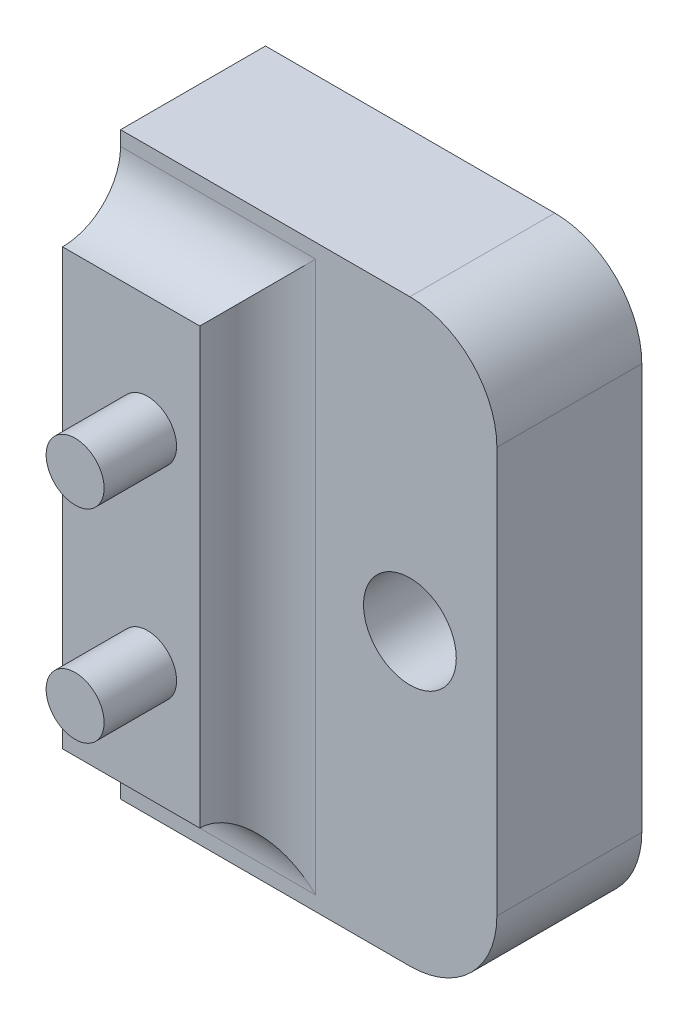
ISO-10303-21;
HEADER;
FILE_DESCRIPTION(('STEP AP214'),'2;1');
FILE_NAME('part.step','',(''),(''),'','','');
FILE_SCHEMA(('AUTOMOTIVE_DESIGN { 1 0 10303 214 1 1 1 1 }'));
ENDSEC;
DATA;
#1=APPLICATION_CONTEXT('core data for automotive mechanical design processes');
#2=APPLICATION_PROTOCOL_DEFINITION('international standard','automotive_design',2000,#1);
#3=PRODUCT_CONTEXT('',#1,'mechanical');
#4=PRODUCT('Part','Part','',(#3));
#5=PRODUCT_RELATED_PRODUCT_CATEGORY('part','',(#4));
#6=PRODUCT_DEFINITION_FORMATION('','',#4);
#7=PRODUCT_DEFINITION_CONTEXT('part definition',#1,'design');
#8=PRODUCT_DEFINITION('design','',#6,#7);
#9=PRODUCT_DEFINITION_SHAPE('','',#8);
#10=(LENGTH_UNIT() NAMED_UNIT(*) SI_UNIT(.MILLI.,.METRE.));
#11=(NAMED_UNIT(*) PLANE_ANGLE_UNIT() SI_UNIT($,.RADIAN.));
#12=(NAMED_UNIT(*) SI_UNIT($,.STERADIAN.) SOLID_ANGLE_UNIT());
#13=UNCERTAINTY_MEASURE_WITH_UNIT(LENGTH_MEASURE(1.E-05),#10,'distance_accuracy_value','');
#14=(GEOMETRIC_REPRESENTATION_CONTEXT(3) GLOBAL_UNCERTAINTY_ASSIGNED_CONTEXT((#13)) GLOBAL_UNIT_ASSIGNED_CONTEXT((#10,
#11,#12)) REPRESENTATION_CONTEXT('',''));
#15=CARTESIAN_POINT('',(0.,0.,0.));
#16=DIRECTION('',(0.,0.,1.));
#17=DIRECTION('',(1.,0.,0.));
#18=AXIS2_PLACEMENT_3D('',#15,#16,#17);
#19=CARTESIAN_POINT('',(12.,17.,5.));
#20=DIRECTION('',(0.,0.,-1.));
#21=DIRECTION('',(-1.,0.,0.));
#22=AXIS2_PLACEMENT_3D('',#19,#20,#21);
#23=PLANE('',#22);
#24=CARTESIAN_POINT('',(12.,10.,5.));
#25=DIRECTION('',(0.,0.,1.));
#26=DIRECTION('',(1.,0.,0.));
#27=AXIS2_PLACEMENT_3D('',#24,#25,#26);
#28=CIRCLE('',#27,1.6);
#29=CARTESIAN_POINT('',(13.6,10.,5.));
#30=VERTEX_POINT('',#29);
#31=EDGE_CURVE('E153',#30,#30,#28,.T.);
#32=ORIENTED_EDGE('',*,*,#31,.F.);
#33=EDGE_LOOP('',(#32));
#34=FACE_BOUND('',#33,.T.);
#35=DIRECTION('',(0.,1.,0.));
#36=VECTOR('',#35,1.);
#37=CARTESIAN_POINT('',(2.0176007858653,17.,5.));
#38=LINE('',#37,#36);
#39=CARTESIAN_POINT('',(2.0176007858653,0.,5.));
#40=VERTEX_POINT('',#39);
#41=CARTESIAN_POINT('',(2.0176007858653,0.500000000000002,5.));
#42=VERTEX_POINT('',#41);
#43=EDGE_CURVE('E123',#40,#42,#38,.T.);
#44=ORIENTED_EDGE('',*,*,#43,.F.);
#45=DIRECTION('',(1.,0.,0.));
#46=VECTOR('',#45,1.);
#47=CARTESIAN_POINT('',(0.,0.,5.));
#48=LINE('',#47,#46);
#49=CARTESIAN_POINT('',(12.,0.,5.));
#50=VERTEX_POINT('',#49);
#51=EDGE_CURVE('E159',#40,#50,#48,.T.);
#52=ORIENTED_EDGE('',*,*,#51,.T.);
#53=CARTESIAN_POINT('',(12.,3.,5.));
#54=DIRECTION('',(0.,0.,1.));
#55=DIRECTION('',(1.,0.,0.));
#56=AXIS2_PLACEMENT_3D('',#53,#54,#55);
#57=CIRCLE('',#56,3.);
#58=CARTESIAN_POINT('',(15.,3.,5.));
#59=VERTEX_POINT('',#58);
#60=EDGE_CURVE('E161',#50,#59,#57,.T.);
#61=ORIENTED_EDGE('',*,*,#60,.T.);
#62=DIRECTION('',(0.,1.,0.));
#63=VECTOR('',#62,1.);
#64=CARTESIAN_POINT('',(15.,3.00000000000002,5.));
#65=LINE('',#64,#63);
#66=CARTESIAN_POINT('',(15.,17.,5.));
#67=VERTEX_POINT('',#66);
#68=EDGE_CURVE('E164',#59,#67,#65,.T.);
#69=ORIENTED_EDGE('',*,*,#68,.T.);
#70=CARTESIAN_POINT('',(12.,17.,5.));
#71=DIRECTION('',(0.,0.,1.));
#72=DIRECTION('',(-1.,0.,0.));
#73=AXIS2_PLACEMENT_3D('',#70,#71,#72);
#74=CIRCLE('',#73,3.);
#75=CARTESIAN_POINT('',(12.,20.,5.));
#76=VERTEX_POINT('',#75);
#77=EDGE_CURVE('E166',#67,#76,#74,.T.);
#78=ORIENTED_EDGE('',*,*,#77,.T.);
#79=DIRECTION('',(-1.,0.,0.));
#80=VECTOR('',#79,1.);
#81=CARTESIAN_POINT('',(0.,20.,5.));
#82=LINE('',#81,#80);
#83=CARTESIAN_POINT('',(2.0176007858653,20.,5.));
#84=VERTEX_POINT('',#83);
#85=EDGE_CURVE('E120',#76,#84,#82,.T.);
#86=ORIENTED_EDGE('',*,*,#85,.T.);
#87=CARTESIAN_POINT('',(2.0176007858653,19.5,5.));
#88=VERTEX_POINT('',#87);
#89=EDGE_CURVE('E112',#88,#84,#38,.T.);
#90=ORIENTED_EDGE('',*,*,#89,.F.);
#91=DIRECTION('',(-1.,0.,0.));
#92=VECTOR('',#91,1.);
#93=CARTESIAN_POINT('',(6.75,19.5,5.));
#94=LINE('',#93,#92);
#95=CARTESIAN_POINT('',(8.75,19.5,5.));
#96=VERTEX_POINT('',#95);
#97=EDGE_CURVE('E46',#88,#96,#94,.F.);
#98=ORIENTED_EDGE('',*,*,#97,.T.);
#99=DIRECTION('',(0.,1.,0.));
#100=VECTOR('',#99,1.);
#101=CARTESIAN_POINT('',(8.75,2.5,5.));
#102=LINE('',#101,#100);
#103=CARTESIAN_POINT('',(8.75,0.500000000000002,5.));
#104=VERTEX_POINT('',#103);
#105=EDGE_CURVE('E128',#96,#104,#102,.F.);
#106=ORIENTED_EDGE('',*,*,#105,.T.);
#107=DIRECTION('',(1.,0.,0.));
#108=VECTOR('',#107,1.);
#109=CARTESIAN_POINT('',(0.,0.500000000000002,5.));
#110=LINE('',#109,#108);
#111=EDGE_CURVE('E130',#104,#42,#110,.F.);
#112=ORIENTED_EDGE('',*,*,#111,.T.);
#113=EDGE_LOOP('',(#44,#52,#61,#69,#78,#86,#90,#98,#106,#112));
#114=FACE_BOUND('',#113,.T.);
#115=ADVANCED_FACE('F38',(#34,#114),#23,.F.);
#116=CARTESIAN_POINT('',(12.,17.,0.));
#117=DIRECTION('',(0.,0.,-1.));
#118=DIRECTION('',(-1.,0.,0.));
#119=AXIS2_PLACEMENT_3D('',#116,#117,#118);
#120=PLANE('',#119);
#121=CARTESIAN_POINT('',(12.,10.,0.));
#122=DIRECTION('',(0.,0.,1.));
#123=DIRECTION('',(1.,0.,0.));
#124=AXIS2_PLACEMENT_3D('',#121,#122,#123);
#125=CIRCLE('',#124,1.6);
#126=CARTESIAN_POINT('',(13.6,10.,0.));
#127=VERTEX_POINT('',#126);
#128=EDGE_CURVE('E152',#127,#127,#125,.T.);
#129=ORIENTED_EDGE('',*,*,#128,.T.);
#130=EDGE_LOOP('',(#129));
#131=FACE_BOUND('',#130,.T.);
#132=DIRECTION('',(1.,0.,0.));
#133=VECTOR('',#132,1.);
#134=CARTESIAN_POINT('',(0.,0.,0.));
#135=LINE('',#134,#133);
#136=CARTESIAN_POINT('',(2.0176007858653,0.,0.));
#137=VERTEX_POINT('',#136);
#138=CARTESIAN_POINT('',(12.,0.,0.));
#139=VERTEX_POINT('',#138);
#140=EDGE_CURVE('E156',#137,#139,#135,.T.);
#141=ORIENTED_EDGE('',*,*,#140,.F.);
#142=DIRECTION('',(0.,1.,0.));
#143=VECTOR('',#142,1.);
#144=CARTESIAN_POINT('',(2.0176007858653,17.,0.));
#145=LINE('',#144,#143);
#146=CARTESIAN_POINT('',(2.0176007858653,20.,0.));
#147=VERTEX_POINT('',#146);
#148=EDGE_CURVE('E196',#137,#147,#145,.T.);
#149=ORIENTED_EDGE('',*,*,#148,.T.);
#150=DIRECTION('',(-1.,0.,0.));
#151=VECTOR('',#150,1.);
#152=CARTESIAN_POINT('',(0.,20.,0.));
#153=LINE('',#152,#151);
#154=CARTESIAN_POINT('',(12.,20.,0.));
#155=VERTEX_POINT('',#154);
#156=EDGE_CURVE('E162',#155,#147,#153,.T.);
#157=ORIENTED_EDGE('',*,*,#156,.F.);
#158=CARTESIAN_POINT('',(12.,17.,0.));
#159=DIRECTION('',(0.,0.,1.));
#160=DIRECTION('',(-1.,0.,0.));
#161=AXIS2_PLACEMENT_3D('',#158,#159,#160);
#162=CIRCLE('',#161,3.);
#163=CARTESIAN_POINT('',(15.,17.,0.));
#164=VERTEX_POINT('',#163);
#165=EDGE_CURVE('E175',#164,#155,#162,.T.);
#166=ORIENTED_EDGE('',*,*,#165,.F.);
#167=DIRECTION('',(0.,1.,0.));
#168=VECTOR('',#167,1.);
#169=CARTESIAN_POINT('',(15.,3.00000000000002,0.));
#170=LINE('',#169,#168);
#171=CARTESIAN_POINT('',(15.,3.,0.));
#172=VERTEX_POINT('',#171);
#173=EDGE_CURVE('E173',#172,#164,#170,.T.);
#174=ORIENTED_EDGE('',*,*,#173,.F.);
#175=CARTESIAN_POINT('',(12.,3.,0.));
#176=DIRECTION('',(0.,0.,1.));
#177=DIRECTION('',(1.,0.,0.));
#178=AXIS2_PLACEMENT_3D('',#175,#176,#177);
#179=CIRCLE('',#178,3.);
#180=EDGE_CURVE('E171',#139,#172,#179,.T.);
#181=ORIENTED_EDGE('',*,*,#180,.F.);
#182=EDGE_LOOP('',(#141,#149,#157,#166,#174,#181));
#183=FACE_BOUND('',#182,.T.);
#184=ADVANCED_FACE('F237',(#131,#183),#120,.T.);
#185=CARTESIAN_POINT('',(0.,0.,5.));
#186=DIRECTION('',(0.,1.,0.));
#187=DIRECTION('',(0.,0.,1.));
#188=AXIS2_PLACEMENT_3D('',#185,#186,#187);
#189=PLANE('',#188);
#190=DIRECTION('',(0.,0.,1.));
#191=VECTOR('',#190,1.);
#192=CARTESIAN_POINT('',(2.0176007858653,0.,5.));
#193=LINE('',#192,#191);
#194=EDGE_CURVE('E202',#137,#40,#193,.T.);
#195=ORIENTED_EDGE('',*,*,#194,.F.);
#196=ORIENTED_EDGE('',*,*,#140,.T.);
#197=DIRECTION('',(0.,0.,-1.));
#198=VECTOR('',#197,1.);
#199=CARTESIAN_POINT('',(12.,0.,5.));
#200=LINE('',#199,#198);
#201=EDGE_CURVE('E187',#50,#139,#200,.T.);
#202=ORIENTED_EDGE('',*,*,#201,.F.);
#203=ORIENTED_EDGE('',*,*,#51,.F.);
#204=EDGE_LOOP('',(#195,#196,#202,#203));
#205=FACE_BOUND('',#204,.T.);
#206=ADVANCED_FACE('F243',(#205),#189,.F.);
#207=CARTESIAN_POINT('',(0.,20.,5.));
#208=DIRECTION('',(0.,-1.,0.));
#209=DIRECTION('',(0.,0.,-1.));
#210=AXIS2_PLACEMENT_3D('',#207,#208,#209);
#211=PLANE('',#210);
#212=DIRECTION('',(0.,0.,-1.));
#213=VECTOR('',#212,1.);
#214=CARTESIAN_POINT('',(2.0176007858653,20.,5.));
#215=LINE('',#214,#213);
#216=EDGE_CURVE('E194',#84,#147,#215,.T.);
#217=ORIENTED_EDGE('',*,*,#216,.F.);
#218=ORIENTED_EDGE('',*,*,#85,.F.);
#219=DIRECTION('',(0.,0.,-1.));
#220=VECTOR('',#219,1.);
#221=CARTESIAN_POINT('',(12.,20.,5.));
#222=LINE('',#221,#220);
#223=EDGE_CURVE('E169',#76,#155,#222,.T.);
#224=ORIENTED_EDGE('',*,*,#223,.T.);
#225=ORIENTED_EDGE('',*,*,#156,.T.);
#226=EDGE_LOOP('',(#217,#218,#224,#225));
#227=FACE_BOUND('',#226,.T.);
#228=ADVANCED_FACE('F219',(#227),#211,.F.);
#229=CARTESIAN_POINT('',(0.,0.,7.));
#230=DIRECTION('',(0.,0.,1.));
#231=DIRECTION('',(1.,0.,0.));
#232=AXIS2_PLACEMENT_3D('',#229,#230,#231);
#233=PLANE('',#232);
#234=CARTESIAN_POINT('',(4.95023571002158,6.5,7.));
#235=DIRECTION('',(0.,0.,1.));
#236=DIRECTION('',(1.,0.,0.));
#237=AXIS2_PLACEMENT_3D('',#234,#235,#236);
#238=CIRCLE('',#237,1.);
#239=CARTESIAN_POINT('',(5.95023571002158,6.5,7.));
#240=VERTEX_POINT('',#239);
#241=EDGE_CURVE('E204',#240,#240,#238,.T.);
#242=ORIENTED_EDGE('',*,*,#241,.F.);
#243=EDGE_LOOP('',(#242));
#244=FACE_BOUND('',#243,.T.);
#245=CARTESIAN_POINT('',(4.95023571002158,13.5,7.));
#246=DIRECTION('',(0.,0.,1.));
#247=DIRECTION('',(1.,0.,0.));
#248=AXIS2_PLACEMENT_3D('',#245,#246,#247);
#249=CIRCLE('',#248,1.);
#250=CARTESIAN_POINT('',(5.95023571002158,13.5,7.));
#251=VERTEX_POINT('',#250);
#252=EDGE_CURVE('E148',#251,#251,#249,.T.);
#253=ORIENTED_EDGE('',*,*,#252,.F.);
#254=EDGE_LOOP('',(#253));
#255=FACE_BOUND('',#254,.T.);
#256=DIRECTION('',(-1.,0.,0.));
#257=VECTOR('',#256,1.);
#258=CARTESIAN_POINT('',(0.,17.5,7.));
#259=LINE('',#258,#257);
#260=CARTESIAN_POINT('',(6.75,17.5,7.));
#261=VERTEX_POINT('',#260);
#262=CARTESIAN_POINT('',(2.0176007858653,17.5,7.));
#263=VERTEX_POINT('',#262);
#264=EDGE_CURVE('E145',#261,#263,#259,.T.);
#265=ORIENTED_EDGE('',*,*,#264,.T.);
#266=DIRECTION('',(0.,-1.,0.));
#267=VECTOR('',#266,1.);
#268=CARTESIAN_POINT('',(2.0176007858653,0.,7.));
#269=LINE('',#268,#267);
#270=CARTESIAN_POINT('',(2.0176007858653,2.5,7.));
#271=VERTEX_POINT('',#270);
#272=EDGE_CURVE('E52',#263,#271,#269,.T.);
#273=ORIENTED_EDGE('',*,*,#272,.T.);
#274=DIRECTION('',(1.,0.,0.));
#275=VECTOR('',#274,1.);
#276=CARTESIAN_POINT('',(0.,2.5,7.));
#277=LINE('',#276,#275);
#278=CARTESIAN_POINT('',(6.75,2.5,7.));
#279=VERTEX_POINT('',#278);
#280=EDGE_CURVE('E137',#271,#279,#277,.T.);
#281=ORIENTED_EDGE('',*,*,#280,.T.);
#282=DIRECTION('',(0.,1.,0.));
#283=VECTOR('',#282,1.);
#284=CARTESIAN_POINT('',(6.75,17.5,7.));
#285=LINE('',#284,#283);
#286=EDGE_CURVE('E141',#279,#261,#285,.T.);
#287=ORIENTED_EDGE('',*,*,#286,.T.);
#288=EDGE_LOOP('',(#265,#273,#281,#287));
#289=FACE_BOUND('',#288,.T.);
#290=ADVANCED_FACE('F217',(#244,#255,#289),#233,.T.);
#291=CARTESIAN_POINT('',(0.,0.500000000000002,7.));
#292=DIRECTION('',(-1.,0.,0.));
#293=DIRECTION('',(0.,0.,1.));
#294=AXIS2_PLACEMENT_3D('',#291,#292,#293);
#295=CYLINDRICAL_SURFACE('',#294,2.);
#296=CARTESIAN_POINT('',(2.0176007858653,0.500000000000002,7.));
#297=DIRECTION('',(-1.,0.,0.));
#298=DIRECTION('',(0.,0.,1.));
#299=AXIS2_PLACEMENT_3D('',#296,#297,#298);
#300=CIRCLE('',#299,2.);
#301=EDGE_CURVE('E121',#42,#271,#300,.F.);
#302=ORIENTED_EDGE('',*,*,#301,.F.);
#303=ORIENTED_EDGE('',*,*,#111,.F.);
#304=CARTESIAN_POINT('',(8.75,0.500000000000001,7.));
#305=DIRECTION('',(-0.707106781186547,-0.707106781186548,0.));
#306=DIRECTION('',(-0.707106781186548,0.707106781186547,0.));
#307=AXIS2_PLACEMENT_3D('',#304,#305,#306);
#308=ELLIPSE('',#307,2.82842712474619,2.);
#309=EDGE_CURVE('E134',#279,#104,#308,.T.);
#310=ORIENTED_EDGE('',*,*,#309,.F.);
#311=ORIENTED_EDGE('',*,*,#280,.F.);
#312=EDGE_LOOP('',(#302,#303,#310,#311));
#313=FACE_BOUND('',#312,.T.);
#314=ADVANCED_FACE('F40',(#313),#295,.F.);
#315=CARTESIAN_POINT('',(0.,19.5,7.));
#316=DIRECTION('',(1.,0.,0.));
#317=DIRECTION('',(0.,0.,-1.));
#318=AXIS2_PLACEMENT_3D('',#315,#316,#317);
#319=CYLINDRICAL_SURFACE('',#318,2.);
#320=CARTESIAN_POINT('',(2.0176007858653,19.5,7.));
#321=DIRECTION('',(-1.,0.,0.));
#322=DIRECTION('',(0.,0.,1.));
#323=AXIS2_PLACEMENT_3D('',#320,#321,#322);
#324=CIRCLE('',#323,2.);
#325=EDGE_CURVE('E11',#263,#88,#324,.F.);
#326=ORIENTED_EDGE('',*,*,#325,.F.);
#327=ORIENTED_EDGE('',*,*,#264,.F.);
#328=CARTESIAN_POINT('',(8.75,19.5,7.));
#329=DIRECTION('',(0.707106781186548,-0.707106781186547,0.));
#330=DIRECTION('',(-0.707106781186547,-0.707106781186548,0.));
#331=AXIS2_PLACEMENT_3D('',#328,#329,#330);
#332=ELLIPSE('',#331,2.82842712474619,2.);
#333=EDGE_CURVE('E127',#261,#96,#332,.T.);
#334=ORIENTED_EDGE('',*,*,#333,.T.);
#335=ORIENTED_EDGE('',*,*,#97,.F.);
#336=EDGE_LOOP('',(#326,#327,#334,#335));
#337=FACE_BOUND('',#336,.T.);
#338=ADVANCED_FACE('F125',(#337),#319,.F.);
#339=CARTESIAN_POINT('',(12.,3.,5.));
#340=DIRECTION('',(0.,0.,-1.));
#341=DIRECTION('',(-1.,0.,0.));
#342=AXIS2_PLACEMENT_3D('',#339,#340,#341);
#343=CYLINDRICAL_SURFACE('',#342,3.);
#344=ORIENTED_EDGE('',*,*,#180,.T.);
#345=DIRECTION('',(0.,0.,-1.));
#346=VECTOR('',#345,1.);
#347=CARTESIAN_POINT('',(15.,3.,5.));
#348=LINE('',#347,#346);
#349=EDGE_CURVE('E184',#59,#172,#348,.T.);
#350=ORIENTED_EDGE('',*,*,#349,.F.);
#351=ORIENTED_EDGE('',*,*,#60,.F.);
#352=ORIENTED_EDGE('',*,*,#201,.T.);
#353=EDGE_LOOP('',(#344,#350,#351,#352));
#354=FACE_BOUND('',#353,.T.);
#355=ADVANCED_FACE('F257',(#354),#343,.T.);
#356=CARTESIAN_POINT('',(15.,3.00000000000002,5.));
#357=DIRECTION('',(-1.,0.,0.));
#358=DIRECTION('',(0.,0.,1.));
#359=AXIS2_PLACEMENT_3D('',#356,#357,#358);
#360=PLANE('',#359);
#361=ORIENTED_EDGE('',*,*,#173,.T.);
#362=DIRECTION('',(0.,0.,-1.));
#363=VECTOR('',#362,1.);
#364=CARTESIAN_POINT('',(15.,17.,5.));
#365=LINE('',#364,#363);
#366=EDGE_CURVE('E181',#67,#164,#365,.T.);
#367=ORIENTED_EDGE('',*,*,#366,.F.);
#368=ORIENTED_EDGE('',*,*,#68,.F.);
#369=ORIENTED_EDGE('',*,*,#349,.T.);
#370=EDGE_LOOP('',(#361,#367,#368,#369));
#371=FACE_BOUND('',#370,.T.);
#372=ADVANCED_FACE('F253',(#371),#360,.F.);
#373=CARTESIAN_POINT('',(12.,17.,5.));
#374=DIRECTION('',(0.,0.,-1.));
#375=DIRECTION('',(-1.,0.,0.));
#376=AXIS2_PLACEMENT_3D('',#373,#374,#375);
#377=CYLINDRICAL_SURFACE('',#376,3.);
#378=ORIENTED_EDGE('',*,*,#165,.T.);
#379=ORIENTED_EDGE('',*,*,#223,.F.);
#380=ORIENTED_EDGE('',*,*,#77,.F.);
#381=ORIENTED_EDGE('',*,*,#366,.T.);
#382=EDGE_LOOP('',(#378,#379,#380,#381));
#383=FACE_BOUND('',#382,.T.);
#384=ADVANCED_FACE('F232',(#383),#377,.T.);
#385=CARTESIAN_POINT('',(12.,10.,5.));
#386=DIRECTION('',(0.,0.,-1.));
#387=DIRECTION('',(-1.,0.,0.));
#388=AXIS2_PLACEMENT_3D('',#385,#386,#387);
#389=CYLINDRICAL_SURFACE('',#388,1.6);
#390=ORIENTED_EDGE('',*,*,#31,.T.);
#391=EDGE_LOOP('',(#390));
#392=FACE_BOUND('',#391,.T.);
#393=ORIENTED_EDGE('',*,*,#128,.F.);
#394=EDGE_LOOP('',(#393));
#395=FACE_BOUND('',#394,.T.);
#396=ADVANCED_FACE('F224',(#392,#395),#389,.F.);
#397=CARTESIAN_POINT('',(8.75,17.5,7.));
#398=DIRECTION('',(0.,-1.,0.));
#399=DIRECTION('',(1.,0.,0.));
#400=AXIS2_PLACEMENT_3D('',#397,#398,#399);
#401=CYLINDRICAL_SURFACE('',#400,2.);
#402=ORIENTED_EDGE('',*,*,#309,.T.);
#403=ORIENTED_EDGE('',*,*,#105,.F.);
#404=ORIENTED_EDGE('',*,*,#333,.F.);
#405=ORIENTED_EDGE('',*,*,#286,.F.);
#406=EDGE_LOOP('',(#402,#403,#404,#405));
#407=FACE_BOUND('',#406,.T.);
#408=ADVANCED_FACE('F222',(#407),#401,.F.);
#409=CARTESIAN_POINT('',(4.95023571002158,13.5,9.5));
#410=DIRECTION('',(0.,0.,-1.));
#411=DIRECTION('',(-1.,0.,0.));
#412=AXIS2_PLACEMENT_3D('',#409,#410,#411);
#413=CYLINDRICAL_SURFACE('',#412,1.);
#414=CARTESIAN_POINT('',(4.95023571002158,13.5,9.5));
#415=DIRECTION('',(0.,0.,1.));
#416=DIRECTION('',(1.,0.,0.));
#417=AXIS2_PLACEMENT_3D('',#414,#415,#416);
#418=CIRCLE('',#417,1.);
#419=CARTESIAN_POINT('',(5.95023571002158,13.5,9.5));
#420=VERTEX_POINT('',#419);
#421=EDGE_CURVE('E135',#420,#420,#418,.T.);
#422=ORIENTED_EDGE('',*,*,#421,.F.);
#423=EDGE_LOOP('',(#422));
#424=FACE_BOUND('',#423,.T.);
#425=ORIENTED_EDGE('',*,*,#252,.T.);
#426=EDGE_LOOP('',(#425));
#427=FACE_BOUND('',#426,.T.);
#428=ADVANCED_FACE('F215',(#424,#427),#413,.T.);
#429=CARTESIAN_POINT('',(4.95023571002158,13.5,9.5));
#430=DIRECTION('',(0.,0.,1.));
#431=DIRECTION('',(1.,0.,0.));
#432=AXIS2_PLACEMENT_3D('',#429,#430,#431);
#433=PLANE('',#432);
#434=ORIENTED_EDGE('',*,*,#421,.T.);
#435=EDGE_LOOP('',(#434));
#436=FACE_BOUND('',#435,.T.);
#437=ADVANCED_FACE('F229',(#436),#433,.T.);
#438=CARTESIAN_POINT('',(4.95023571002158,6.5,9.5));
#439=DIRECTION('',(0.,0.,-1.));
#440=DIRECTION('',(-1.,0.,0.));
#441=AXIS2_PLACEMENT_3D('',#438,#439,#440);
#442=CYLINDRICAL_SURFACE('',#441,1.);
#443=CARTESIAN_POINT('',(4.95023571002158,6.5,9.5));
#444=DIRECTION('',(0.,0.,1.));
#445=DIRECTION('',(1.,0.,0.));
#446=AXIS2_PLACEMENT_3D('',#443,#444,#445);
#447=CIRCLE('',#446,1.);
#448=CARTESIAN_POINT('',(5.95023571002158,6.5,9.5));
#449=VERTEX_POINT('',#448);
#450=EDGE_CURVE('E205',#449,#449,#447,.T.);
#451=ORIENTED_EDGE('',*,*,#450,.F.);
#452=EDGE_LOOP('',(#451));
#453=FACE_BOUND('',#452,.T.);
#454=ORIENTED_EDGE('',*,*,#241,.T.);
#455=EDGE_LOOP('',(#454));
#456=FACE_BOUND('',#455,.T.);
#457=ADVANCED_FACE('F301',(#453,#456),#442,.T.);
#458=CARTESIAN_POINT('',(4.95023571002158,6.5,9.5));
#459=DIRECTION('',(0.,0.,1.));
#460=DIRECTION('',(1.,0.,0.));
#461=AXIS2_PLACEMENT_3D('',#458,#459,#460);
#462=PLANE('',#461);
#463=ORIENTED_EDGE('',*,*,#450,.T.);
#464=EDGE_LOOP('',(#463));
#465=FACE_BOUND('',#464,.T.);
#466=ADVANCED_FACE('F296',(#465),#462,.T.);
#467=CARTESIAN_POINT('',(2.0176007858653,-2.61012136373045,11.));
#468=DIRECTION('',(-1.,0.,0.));
#469=DIRECTION('',(0.,0.,1.));
#470=AXIS2_PLACEMENT_3D('',#467,#468,#469);
#471=PLANE('',#470);
#472=ORIENTED_EDGE('',*,*,#194,.T.);
#473=ORIENTED_EDGE('',*,*,#43,.T.);
#474=ORIENTED_EDGE('',*,*,#301,.T.);
#475=ORIENTED_EDGE('',*,*,#272,.F.);
#476=ORIENTED_EDGE('',*,*,#325,.T.);
#477=ORIENTED_EDGE('',*,*,#89,.T.);
#478=ORIENTED_EDGE('',*,*,#216,.T.);
#479=ORIENTED_EDGE('',*,*,#148,.F.);
#480=EDGE_LOOP('',(#472,#473,#474,#475,#476,#477,#478,#479));
#481=FACE_BOUND('',#480,.T.);
#482=ADVANCED_FACE('F111',(#481),#471,.T.);
#483=CLOSED_SHELL('',(#115,#184,#206,#228,#290,#314,#338,#355,#372,#384,#396,#408,#428,#437,
#457,#466,#482));
#484=MANIFOLD_SOLID_BREP('B2',#483);
#485=ADVANCED_BREP_SHAPE_REPRESENTATION('',(#18,#484),#14);
#486=SHAPE_DEFINITION_REPRESENTATION(#9,#485);
ENDSEC;
END-ISO-10303-21;
